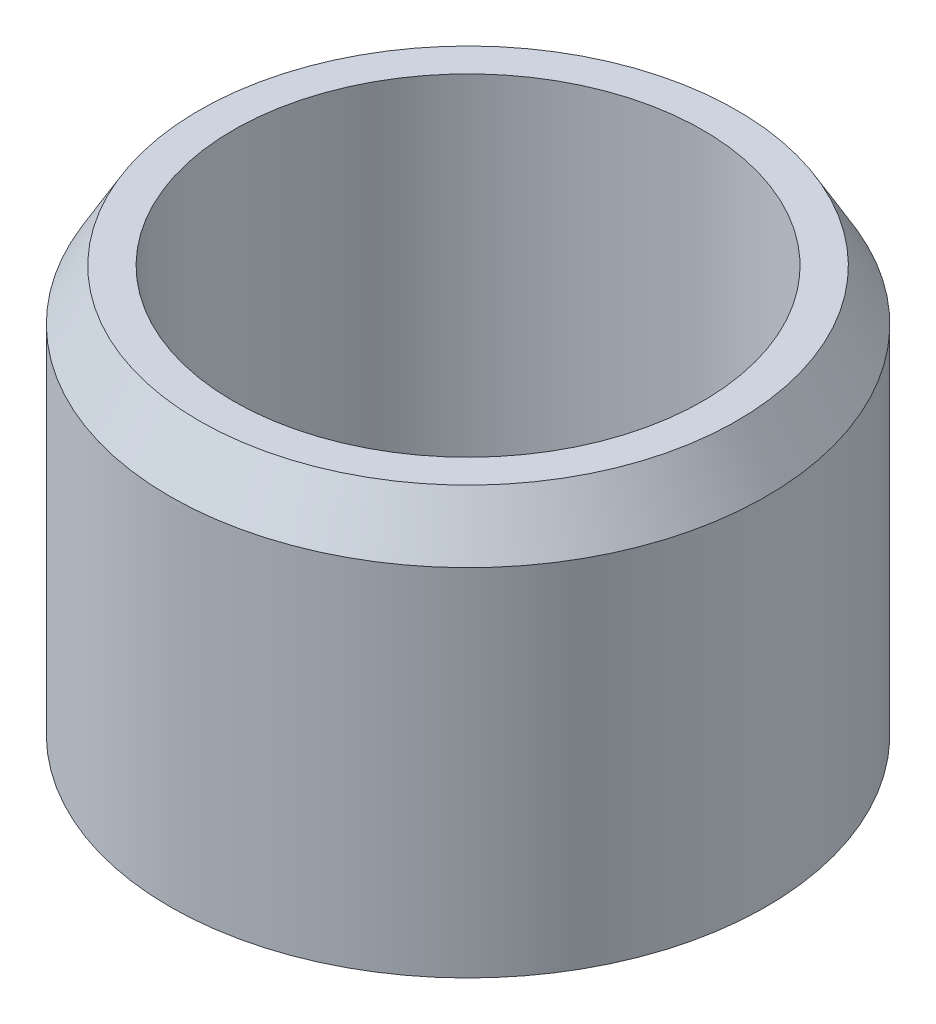
ISO-10303-21;
HEADER;
FILE_DESCRIPTION(('STEP AP214'),'2;1');
FILE_NAME('part.step','',(''),(''),'','','');
FILE_SCHEMA(('AUTOMOTIVE_DESIGN { 1 0 10303 214 1 1 1 1 }'));
ENDSEC;
DATA;
#1=APPLICATION_CONTEXT('core data for automotive mechanical design processes');
#2=APPLICATION_PROTOCOL_DEFINITION('international standard','automotive_design',2000,#1);
#3=PRODUCT_CONTEXT('',#1,'mechanical');
#4=PRODUCT('Part','Part','',(#3));
#5=PRODUCT_RELATED_PRODUCT_CATEGORY('part','',(#4));
#6=PRODUCT_DEFINITION_FORMATION('','',#4);
#7=PRODUCT_DEFINITION_CONTEXT('part definition',#1,'design');
#8=PRODUCT_DEFINITION('design','',#6,#7);
#9=PRODUCT_DEFINITION_SHAPE('','',#8);
#10=(LENGTH_UNIT() NAMED_UNIT(*) SI_UNIT(.MILLI.,.METRE.));
#11=(NAMED_UNIT(*) PLANE_ANGLE_UNIT() SI_UNIT($,.RADIAN.));
#12=(NAMED_UNIT(*) SI_UNIT($,.STERADIAN.) SOLID_ANGLE_UNIT());
#13=UNCERTAINTY_MEASURE_WITH_UNIT(LENGTH_MEASURE(1.E-05),#10,'distance_accuracy_value','');
#14=(GEOMETRIC_REPRESENTATION_CONTEXT(3) GLOBAL_UNCERTAINTY_ASSIGNED_CONTEXT((#13)) GLOBAL_UNIT_ASSIGNED_CONTEXT((#10,
#11,#12)) REPRESENTATION_CONTEXT('',''));
#15=CARTESIAN_POINT('',(0.,0.,0.));
#16=DIRECTION('',(0.,0.,1.));
#17=DIRECTION('',(1.,0.,0.));
#18=AXIS2_PLACEMENT_3D('',#15,#16,#17);
#19=CARTESIAN_POINT('',(0.,32.,0.));
#20=DIRECTION('',(0.,-1.,0.));
#21=DIRECTION('',(0.,0.,-1.));
#22=AXIS2_PLACEMENT_3D('',#19,#20,#21);
#23=CYLINDRICAL_SURFACE('',#22,23.5);
#24=CARTESIAN_POINT('',(0.,28.,0.));
#25=DIRECTION('',(0.,1.,0.));
#26=DIRECTION('',(0.,0.,1.));
#27=AXIS2_PLACEMENT_3D('',#24,#25,#26);
#28=CIRCLE('',#27,23.5);
#29=CARTESIAN_POINT('',(0.,28.,23.5));
#30=VERTEX_POINT('',#29);
#31=EDGE_CURVE('E10',#30,#30,#28,.F.);
#32=ORIENTED_EDGE('',*,*,#31,.T.);
#33=EDGE_LOOP('',(#32));
#34=FACE_BOUND('',#33,.T.);
#35=CARTESIAN_POINT('',(0.,0.,0.));
#36=DIRECTION('',(0.,1.,0.));
#37=DIRECTION('',(0.,0.,1.));
#38=AXIS2_PLACEMENT_3D('',#35,#36,#37);
#39=CIRCLE('',#38,23.5);
#40=CARTESIAN_POINT('',(0.,0.,23.5));
#41=VERTEX_POINT('',#40);
#42=EDGE_CURVE('E44',#41,#41,#39,.T.);
#43=ORIENTED_EDGE('',*,*,#42,.T.);
#44=EDGE_LOOP('',(#43));
#45=FACE_BOUND('',#44,.T.);
#46=ADVANCED_FACE('F33',(#34,#45),#23,.T.);
#47=CARTESIAN_POINT('',(0.,32.,0.));
#48=DIRECTION('',(0.,1.,0.));
#49=DIRECTION('',(0.,0.,1.));
#50=AXIS2_PLACEMENT_3D('',#47,#48,#49);
#51=PLANE('',#50);
#52=CARTESIAN_POINT('',(0.,32.,0.));
#53=DIRECTION('',(0.,1.,0.));
#54=DIRECTION('',(0.,0.,1.));
#55=AXIS2_PLACEMENT_3D('',#52,#53,#54);
#56=CIRCLE('',#55,21.1905989232415);
#57=CARTESIAN_POINT('',(0.,32.,21.1905989232415));
#58=VERTEX_POINT('',#57);
#59=EDGE_CURVE('E40',#58,#58,#56,.T.);
#60=ORIENTED_EDGE('',*,*,#59,.T.);
#61=EDGE_LOOP('',(#60));
#62=FACE_BOUND('',#61,.T.);
#63=CARTESIAN_POINT('',(0.,32.,0.));
#64=DIRECTION('',(0.,1.,0.));
#65=DIRECTION('',(0.,0.,1.));
#66=AXIS2_PLACEMENT_3D('',#63,#64,#65);
#67=CIRCLE('',#66,18.5);
#68=CARTESIAN_POINT('',(0.,32.,18.5));
#69=VERTEX_POINT('',#68);
#70=EDGE_CURVE('E51',#69,#69,#67,.T.);
#71=ORIENTED_EDGE('',*,*,#70,.F.);
#72=EDGE_LOOP('',(#71));
#73=FACE_BOUND('',#72,.T.);
#74=ADVANCED_FACE('F66',(#62,#73),#51,.T.);
#75=CARTESIAN_POINT('',(0.,0.,0.));
#76=DIRECTION('',(0.,1.,0.));
#77=DIRECTION('',(0.,0.,1.));
#78=AXIS2_PLACEMENT_3D('',#75,#76,#77);
#79=PLANE('',#78);
#80=CARTESIAN_POINT('',(0.,0.,0.));
#81=DIRECTION('',(0.,1.,0.));
#82=DIRECTION('',(0.,0.,1.));
#83=AXIS2_PLACEMENT_3D('',#80,#81,#82);
#84=CIRCLE('',#83,18.5);
#85=CARTESIAN_POINT('',(0.,0.,18.5));
#86=VERTEX_POINT('',#85);
#87=EDGE_CURVE('E48',#86,#86,#84,.T.);
#88=ORIENTED_EDGE('',*,*,#87,.T.);
#89=EDGE_LOOP('',(#88));
#90=FACE_BOUND('',#89,.T.);
#91=ORIENTED_EDGE('',*,*,#42,.F.);
#92=EDGE_LOOP('',(#91));
#93=FACE_BOUND('',#92,.T.);
#94=ADVANCED_FACE('F57',(#90,#93),#79,.F.);
#95=CARTESIAN_POINT('',(0.,0.,0.));
#96=DIRECTION('',(0.,1.,0.));
#97=DIRECTION('',(0.,0.,1.));
#98=AXIS2_PLACEMENT_3D('',#95,#96,#97);
#99=CYLINDRICAL_SURFACE('',#98,18.5);
#100=ORIENTED_EDGE('',*,*,#87,.F.);
#101=EDGE_LOOP('',(#100));
#102=FACE_BOUND('',#101,.T.);
#103=ORIENTED_EDGE('',*,*,#70,.T.);
#104=EDGE_LOOP('',(#103));
#105=FACE_BOUND('',#104,.T.);
#106=ADVANCED_FACE('F60',(#102,#105),#99,.F.);
#107=CARTESIAN_POINT('',(0.,32.,0.));
#108=DIRECTION('',(0.,-1.,0.));
#109=DIRECTION('',(0.,0.,-1.));
#110=AXIS2_PLACEMENT_3D('',#107,#108,#109);
#111=CONICAL_SURFACE('',#110,21.1905989232415,0.523598775598297);
#112=ORIENTED_EDGE('',*,*,#31,.F.);
#113=EDGE_LOOP('',(#112));
#114=FACE_BOUND('',#113,.T.);
#115=ORIENTED_EDGE('',*,*,#59,.F.);
#116=EDGE_LOOP('',(#115));
#117=FACE_BOUND('',#116,.T.);
#118=ADVANCED_FACE('F35',(#114,#117),#111,.T.);
#119=CLOSED_SHELL('',(#46,#74,#94,#106,#118));
#120=MANIFOLD_SOLID_BREP('B2',#119);
#121=ADVANCED_BREP_SHAPE_REPRESENTATION('',(#18,#120),#14);
#122=SHAPE_DEFINITION_REPRESENTATION(#9,#121);
ENDSEC;
END-ISO-10303-21;
